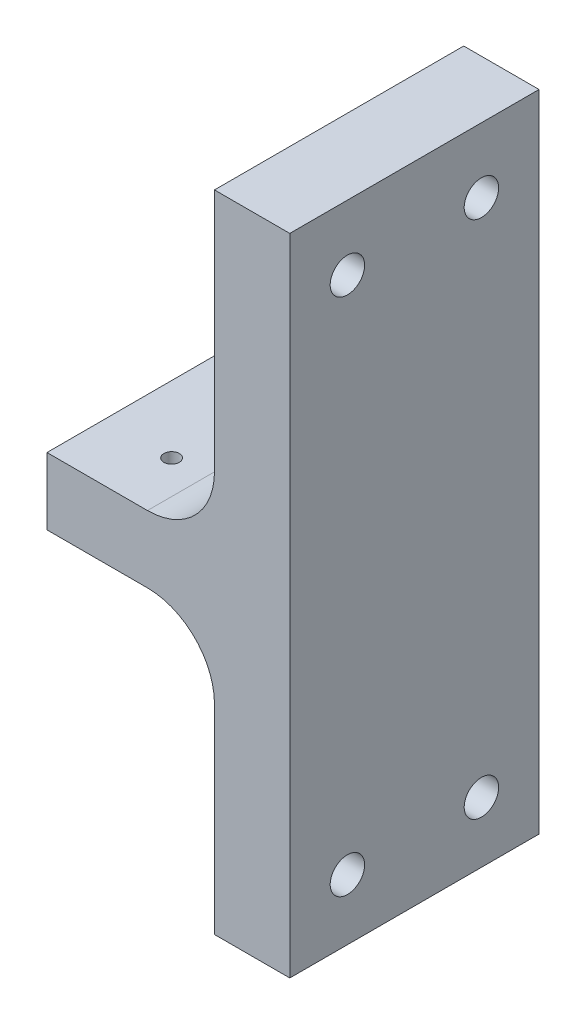
ISO-10303-21;
HEADER;
FILE_DESCRIPTION(('STEP AP214'),'2;1');
FILE_NAME('part.step','',(''),(''),'','','');
FILE_SCHEMA(('AUTOMOTIVE_DESIGN { 1 0 10303 214 1 1 1 1 }'));
ENDSEC;
DATA;
#1=APPLICATION_CONTEXT('core data for automotive mechanical design processes');
#2=APPLICATION_PROTOCOL_DEFINITION('international standard','automotive_design',2000,#1);
#3=PRODUCT_CONTEXT('',#1,'mechanical');
#4=PRODUCT('Part','Part','',(#3));
#5=PRODUCT_RELATED_PRODUCT_CATEGORY('part','',(#4));
#6=PRODUCT_DEFINITION_FORMATION('','',#4);
#7=PRODUCT_DEFINITION_CONTEXT('part definition',#1,'design');
#8=PRODUCT_DEFINITION('design','',#6,#7);
#9=PRODUCT_DEFINITION_SHAPE('','',#8);
#10=(LENGTH_UNIT() NAMED_UNIT(*) SI_UNIT(.MILLI.,.METRE.));
#11=(NAMED_UNIT(*) PLANE_ANGLE_UNIT() SI_UNIT($,.RADIAN.));
#12=(NAMED_UNIT(*) SI_UNIT($,.STERADIAN.) SOLID_ANGLE_UNIT());
#13=UNCERTAINTY_MEASURE_WITH_UNIT(LENGTH_MEASURE(1.E-05),#10,'distance_accuracy_value','');
#14=(GEOMETRIC_REPRESENTATION_CONTEXT(3) GLOBAL_UNCERTAINTY_ASSIGNED_CONTEXT((#13)) GLOBAL_UNIT_ASSIGNED_CONTEXT((#10,
#11,#12)) REPRESENTATION_CONTEXT('',''));
#15=CARTESIAN_POINT('',(0.,0.,0.));
#16=DIRECTION('',(0.,0.,1.));
#17=DIRECTION('',(1.,0.,0.));
#18=AXIS2_PLACEMENT_3D('',#15,#16,#17);
#19=CARTESIAN_POINT('',(0.,12.7,0.));
#20=DIRECTION('',(0.,-1.,0.));
#21=DIRECTION('',(0.,0.,-1.));
#22=AXIS2_PLACEMENT_3D('',#19,#20,#21);
#23=PLANE('',#22);
#24=DIRECTION('',(1.,0.,0.));
#25=VECTOR('',#24,1.);
#26=CARTESIAN_POINT('',(-12.7,12.7,23.622));
#27=LINE('',#26,#25);
#28=CARTESIAN_POINT('',(-12.7,12.7,23.622));
#29=VERTEX_POINT('',#28);
#30=CARTESIAN_POINT('',(6.35000000000001,12.7,23.622));
#31=VERTEX_POINT('',#30);
#32=EDGE_CURVE('E202',#29,#31,#27,.T.);
#33=ORIENTED_EDGE('',*,*,#32,.T.);
#34=DIRECTION('',(0.,0.,-1.));
#35=VECTOR('',#34,1.);
#36=CARTESIAN_POINT('',(6.35,12.7,0.));
#37=LINE('',#36,#35);
#38=CARTESIAN_POINT('',(6.35,12.7,-23.622));
#39=VERTEX_POINT('',#38);
#40=EDGE_CURVE('E222',#31,#39,#37,.T.);
#41=ORIENTED_EDGE('',*,*,#40,.T.);
#42=DIRECTION('',(-1.,0.,0.));
#43=VECTOR('',#42,1.);
#44=CARTESIAN_POINT('',(12.7,12.7,-23.622));
#45=LINE('',#44,#43);
#46=CARTESIAN_POINT('',(-12.7,12.7,-23.622));
#47=VERTEX_POINT('',#46);
#48=EDGE_CURVE('E195',#39,#47,#45,.T.);
#49=ORIENTED_EDGE('',*,*,#48,.T.);
#50=DIRECTION('',(0.,0.,1.));
#51=VECTOR('',#50,1.);
#52=CARTESIAN_POINT('',(-12.7,12.7,23.622));
#53=LINE('',#52,#51);
#54=EDGE_CURVE('E198',#47,#29,#53,.T.);
#55=ORIENTED_EDGE('',*,*,#54,.T.);
#56=EDGE_LOOP('',(#33,#41,#49,#55));
#57=FACE_BOUND('',#56,.T.);
#58=CARTESIAN_POINT('',(0.,12.7,-12.7));
#59=DIRECTION('',(0.,1.,0.));
#60=DIRECTION('',(0.,0.,1.));
#61=AXIS2_PLACEMENT_3D('',#58,#59,#60);
#62=CIRCLE('',#61,1.4605);
#63=CARTESIAN_POINT('',(0.,12.7,-11.2395));
#64=VERTEX_POINT('',#63);
#65=EDGE_CURVE('E187',#64,#64,#62,.T.);
#66=ORIENTED_EDGE('',*,*,#65,.F.);
#67=EDGE_LOOP('',(#66));
#68=FACE_BOUND('',#67,.T.);
#69=CARTESIAN_POINT('',(0.,12.7,12.7));
#70=DIRECTION('',(0.,1.,0.));
#71=DIRECTION('',(0.,0.,1.));
#72=AXIS2_PLACEMENT_3D('',#69,#70,#71);
#73=CIRCLE('',#72,1.4605);
#74=CARTESIAN_POINT('',(0.,12.7,14.1605));
#75=VERTEX_POINT('',#74);
#76=EDGE_CURVE('E179',#75,#75,#73,.T.);
#77=ORIENTED_EDGE('',*,*,#76,.F.);
#78=EDGE_LOOP('',(#77));
#79=FACE_BOUND('',#78,.T.);
#80=ADVANCED_FACE('F42',(#57,#68,#79),#23,.F.);
#81=CARTESIAN_POINT('',(0.,0.,0.));
#82=DIRECTION('',(0.,-1.,0.));
#83=DIRECTION('',(0.,0.,-1.));
#84=AXIS2_PLACEMENT_3D('',#81,#82,#83);
#85=PLANE('',#84);
#86=CARTESIAN_POINT('',(0.,0.,-12.7));
#87=DIRECTION('',(0.,1.,0.));
#88=DIRECTION('',(0.,0.,1.));
#89=AXIS2_PLACEMENT_3D('',#86,#87,#88);
#90=CIRCLE('',#89,1.4605);
#91=CARTESIAN_POINT('',(0.,0.,-11.2395));
#92=VERTEX_POINT('',#91);
#93=EDGE_CURVE('E183',#92,#92,#90,.T.);
#94=ORIENTED_EDGE('',*,*,#93,.T.);
#95=EDGE_LOOP('',(#94));
#96=FACE_BOUND('',#95,.T.);
#97=DIRECTION('',(-1.,0.,0.));
#98=VECTOR('',#97,1.);
#99=CARTESIAN_POINT('',(-12.7,0.,-23.622));
#100=LINE('',#99,#98);
#101=CARTESIAN_POINT('',(6.35,0.,-23.622));
#102=VERTEX_POINT('',#101);
#103=CARTESIAN_POINT('',(-12.7,0.,-23.622));
#104=VERTEX_POINT('',#103);
#105=EDGE_CURVE('E191',#102,#104,#100,.T.);
#106=ORIENTED_EDGE('',*,*,#105,.F.);
#107=DIRECTION('',(0.,0.,-1.));
#108=VECTOR('',#107,1.);
#109=CARTESIAN_POINT('',(6.35000000000001,0.,23.622));
#110=LINE('',#109,#108);
#111=CARTESIAN_POINT('',(6.35000000000001,0.,23.622));
#112=VERTEX_POINT('',#111);
#113=EDGE_CURVE('E60',#102,#112,#110,.F.);
#114=ORIENTED_EDGE('',*,*,#113,.T.);
#115=DIRECTION('',(1.,0.,0.));
#116=VECTOR('',#115,1.);
#117=CARTESIAN_POINT('',(12.7,0.,23.622));
#118=LINE('',#117,#116);
#119=CARTESIAN_POINT('',(-12.7,0.,23.622));
#120=VERTEX_POINT('',#119);
#121=EDGE_CURVE('E199',#120,#112,#118,.T.);
#122=ORIENTED_EDGE('',*,*,#121,.F.);
#123=DIRECTION('',(0.,0.,1.));
#124=VECTOR('',#123,1.);
#125=CARTESIAN_POINT('',(-12.7,0.,23.622));
#126=LINE('',#125,#124);
#127=EDGE_CURVE('E209',#104,#120,#126,.T.);
#128=ORIENTED_EDGE('',*,*,#127,.F.);
#129=EDGE_LOOP('',(#106,#114,#122,#128));
#130=FACE_BOUND('',#129,.T.);
#131=CARTESIAN_POINT('',(0.,0.,12.7));
#132=DIRECTION('',(0.,1.,0.));
#133=DIRECTION('',(0.,0.,1.));
#134=AXIS2_PLACEMENT_3D('',#131,#132,#133);
#135=CIRCLE('',#134,1.4605);
#136=CARTESIAN_POINT('',(0.,0.,14.1605));
#137=VERTEX_POINT('',#136);
#138=EDGE_CURVE('E141',#137,#137,#135,.T.);
#139=ORIENTED_EDGE('',*,*,#138,.T.);
#140=EDGE_LOOP('',(#139));
#141=FACE_BOUND('',#140,.T.);
#142=ADVANCED_FACE('F317',(#96,#130,#141),#85,.T.);
#143=CARTESIAN_POINT('',(-12.7,12.7,-23.622));
#144=DIRECTION('',(0.,0.,1.));
#145=DIRECTION('',(1.,0.,0.));
#146=AXIS2_PLACEMENT_3D('',#143,#144,#145);
#147=PLANE('',#146);
#148=DIRECTION('',(0.,1.,0.));
#149=VECTOR('',#148,1.);
#150=CARTESIAN_POINT('',(19.05,71.6788,-23.622));
#151=LINE('',#150,#149);
#152=CARTESIAN_POINT('',(19.05,-50.546,-23.622));
#153=VERTEX_POINT('',#152);
#154=CARTESIAN_POINT('',(19.05,-12.7,-23.622));
#155=VERTEX_POINT('',#154);
#156=EDGE_CURVE('E165',#153,#155,#151,.T.);
#157=ORIENTED_EDGE('',*,*,#156,.T.);
#158=CARTESIAN_POINT('',(6.35,-12.7,-23.622));
#159=DIRECTION('',(0.,0.,1.));
#160=DIRECTION('',(1.,0.,0.));
#161=AXIS2_PLACEMENT_3D('',#158,#159,#160);
#162=CIRCLE('',#161,12.7);
#163=EDGE_CURVE('E52',#155,#102,#162,.T.);
#164=ORIENTED_EDGE('',*,*,#163,.T.);
#165=ORIENTED_EDGE('',*,*,#105,.T.);
#166=DIRECTION('',(0.,-1.,0.));
#167=VECTOR('',#166,1.);
#168=CARTESIAN_POINT('',(-12.7,12.7,-23.622));
#169=LINE('',#168,#167);
#170=EDGE_CURVE('E218',#47,#104,#169,.T.);
#171=ORIENTED_EDGE('',*,*,#170,.F.);
#172=ORIENTED_EDGE('',*,*,#48,.F.);
#173=CARTESIAN_POINT('',(6.35,25.4,-23.622));
#174=DIRECTION('',(0.,0.,1.));
#175=DIRECTION('',(1.,0.,0.));
#176=AXIS2_PLACEMENT_3D('',#173,#174,#175);
#177=CIRCLE('',#176,12.7);
#178=CARTESIAN_POINT('',(19.05,25.4,-23.622));
#179=VERTEX_POINT('',#178);
#180=EDGE_CURVE('E235',#39,#179,#177,.T.);
#181=ORIENTED_EDGE('',*,*,#180,.T.);
#182=CARTESIAN_POINT('',(19.05,71.6788,-23.622));
#183=VERTEX_POINT('',#182);
#184=EDGE_CURVE('E164',#179,#183,#151,.T.);
#185=ORIENTED_EDGE('',*,*,#184,.T.);
#186=DIRECTION('',(-1.,0.,0.));
#187=VECTOR('',#186,1.);
#188=CARTESIAN_POINT('',(33.3248,71.6788,-23.622));
#189=LINE('',#188,#187);
#190=CARTESIAN_POINT('',(33.3248,71.6788,-23.622));
#191=VERTEX_POINT('',#190);
#192=EDGE_CURVE('E173',#191,#183,#189,.T.);
#193=ORIENTED_EDGE('',*,*,#192,.F.);
#194=DIRECTION('',(0.,1.,0.));
#195=VECTOR('',#194,1.);
#196=CARTESIAN_POINT('',(33.3248,71.6788,-23.622));
#197=LINE('',#196,#195);
#198=CARTESIAN_POINT('',(33.3248,-50.546,-23.622));
#199=VERTEX_POINT('',#198);
#200=EDGE_CURVE('E148',#199,#191,#197,.T.);
#201=ORIENTED_EDGE('',*,*,#200,.F.);
#202=DIRECTION('',(-1.,0.,0.));
#203=VECTOR('',#202,1.);
#204=CARTESIAN_POINT('',(33.3248,-50.546,-23.622));
#205=LINE('',#204,#203);
#206=EDGE_CURVE('E142',#199,#153,#205,.T.);
#207=ORIENTED_EDGE('',*,*,#206,.T.);
#208=EDGE_LOOP('',(#157,#164,#165,#171,#172,#181,#185,#193,#201,#207));
#209=FACE_BOUND('',#208,.T.);
#210=ADVANCED_FACE('F274',(#209),#147,.F.);
#211=CARTESIAN_POINT('',(-12.7,12.7,23.622));
#212=DIRECTION('',(1.,0.,0.));
#213=DIRECTION('',(0.,0.,-1.));
#214=AXIS2_PLACEMENT_3D('',#211,#212,#213);
#215=PLANE('',#214);
#216=ORIENTED_EDGE('',*,*,#127,.T.);
#217=DIRECTION('',(0.,-1.,0.));
#218=VECTOR('',#217,1.);
#219=CARTESIAN_POINT('',(-12.7,12.7,23.622));
#220=LINE('',#219,#218);
#221=EDGE_CURVE('E206',#29,#120,#220,.T.);
#222=ORIENTED_EDGE('',*,*,#221,.F.);
#223=ORIENTED_EDGE('',*,*,#54,.F.);
#224=ORIENTED_EDGE('',*,*,#170,.T.);
#225=EDGE_LOOP('',(#216,#222,#223,#224));
#226=FACE_BOUND('',#225,.T.);
#227=ADVANCED_FACE('F294',(#226),#215,.F.);
#228=CARTESIAN_POINT('',(12.7,12.7,23.622));
#229=DIRECTION('',(0.,0.,-1.));
#230=DIRECTION('',(-1.,0.,0.));
#231=AXIS2_PLACEMENT_3D('',#228,#229,#230);
#232=PLANE('',#231);
#233=ORIENTED_EDGE('',*,*,#121,.T.);
#234=CARTESIAN_POINT('',(6.35000000000001,-12.7,23.622));
#235=DIRECTION('',(0.,0.,-1.));
#236=DIRECTION('',(-1.,0.,0.));
#237=AXIS2_PLACEMENT_3D('',#234,#235,#236);
#238=CIRCLE('',#237,12.7);
#239=CARTESIAN_POINT('',(19.05,-12.7,23.622));
#240=VERTEX_POINT('',#239);
#241=EDGE_CURVE('E11',#112,#240,#238,.T.);
#242=ORIENTED_EDGE('',*,*,#241,.T.);
#243=DIRECTION('',(0.,-1.,0.));
#244=VECTOR('',#243,1.);
#245=CARTESIAN_POINT('',(19.05,0.,23.622));
#246=LINE('',#245,#244);
#247=CARTESIAN_POINT('',(19.05,-50.546,23.622));
#248=VERTEX_POINT('',#247);
#249=EDGE_CURVE('E137',#240,#248,#246,.T.);
#250=ORIENTED_EDGE('',*,*,#249,.T.);
#251=DIRECTION('',(-1.,0.,0.));
#252=VECTOR('',#251,1.);
#253=CARTESIAN_POINT('',(33.3248,-50.546,23.622));
#254=LINE('',#253,#252);
#255=CARTESIAN_POINT('',(33.3248,-50.546,23.622));
#256=VERTEX_POINT('',#255);
#257=EDGE_CURVE('E134',#256,#248,#254,.T.);
#258=ORIENTED_EDGE('',*,*,#257,.F.);
#259=DIRECTION('',(0.,-1.,0.));
#260=VECTOR('',#259,1.);
#261=CARTESIAN_POINT('',(33.3248,0.,23.622));
#262=LINE('',#261,#260);
#263=CARTESIAN_POINT('',(33.3248,71.6788,23.622));
#264=VERTEX_POINT('',#263);
#265=EDGE_CURVE('E119',#264,#256,#262,.T.);
#266=ORIENTED_EDGE('',*,*,#265,.F.);
#267=DIRECTION('',(-1.,0.,0.));
#268=VECTOR('',#267,1.);
#269=CARTESIAN_POINT('',(33.3248,71.6788,23.622));
#270=LINE('',#269,#268);
#271=CARTESIAN_POINT('',(19.05,71.6788,23.622));
#272=VERTEX_POINT('',#271);
#273=EDGE_CURVE('E156',#264,#272,#270,.T.);
#274=ORIENTED_EDGE('',*,*,#273,.T.);
#275=CARTESIAN_POINT('',(19.05,25.4,23.622));
#276=VERTEX_POINT('',#275);
#277=EDGE_CURVE('E157',#272,#276,#246,.T.);
#278=ORIENTED_EDGE('',*,*,#277,.T.);
#279=CARTESIAN_POINT('',(6.35000000000001,25.4,23.622));
#280=DIRECTION('',(0.,0.,-1.));
#281=DIRECTION('',(-1.,0.,0.));
#282=AXIS2_PLACEMENT_3D('',#279,#280,#281);
#283=CIRCLE('',#282,12.7);
#284=EDGE_CURVE('E238',#276,#31,#283,.T.);
#285=ORIENTED_EDGE('',*,*,#284,.T.);
#286=ORIENTED_EDGE('',*,*,#32,.F.);
#287=ORIENTED_EDGE('',*,*,#221,.T.);
#288=EDGE_LOOP('',(#233,#242,#250,#258,#266,#274,#278,#285,#286,#287));
#289=FACE_BOUND('',#288,.T.);
#290=ADVANCED_FACE('F135',(#289),#232,.F.);
#291=CARTESIAN_POINT('',(0.,12.7,-12.7));
#292=DIRECTION('',(0.,-1.,0.));
#293=DIRECTION('',(0.,0.,-1.));
#294=AXIS2_PLACEMENT_3D('',#291,#292,#293);
#295=CYLINDRICAL_SURFACE('',#294,1.4605);
#296=ORIENTED_EDGE('',*,*,#65,.T.);
#297=EDGE_LOOP('',(#296));
#298=FACE_BOUND('',#297,.T.);
#299=ORIENTED_EDGE('',*,*,#93,.F.);
#300=EDGE_LOOP('',(#299));
#301=FACE_BOUND('',#300,.T.);
#302=ADVANCED_FACE('F325',(#298,#301),#295,.F.);
#303=CARTESIAN_POINT('',(0.,12.7,12.7));
#304=DIRECTION('',(0.,-1.,0.));
#305=DIRECTION('',(0.,0.,-1.));
#306=AXIS2_PLACEMENT_3D('',#303,#304,#305);
#307=CYLINDRICAL_SURFACE('',#306,1.4605);
#308=ORIENTED_EDGE('',*,*,#76,.T.);
#309=EDGE_LOOP('',(#308));
#310=FACE_BOUND('',#309,.T.);
#311=ORIENTED_EDGE('',*,*,#138,.F.);
#312=EDGE_LOOP('',(#311));
#313=FACE_BOUND('',#312,.T.);
#314=ADVANCED_FACE('F314',(#310,#313),#307,.F.);
#315=CARTESIAN_POINT('',(19.05,0.,0.));
#316=DIRECTION('',(-1.,0.,0.));
#317=DIRECTION('',(0.,0.,1.));
#318=AXIS2_PLACEMENT_3D('',#315,#316,#317);
#319=PLANE('',#318);
#320=CARTESIAN_POINT('',(19.05,59.3852,12.7));
#321=DIRECTION('',(-1.,0.,0.));
#322=DIRECTION('',(0.,0.,1.));
#323=AXIS2_PLACEMENT_3D('',#320,#321,#322);
#324=CIRCLE('',#323,3.26390000000001);
#325=CARTESIAN_POINT('',(19.05,59.3852,15.9639));
#326=VERTEX_POINT('',#325);
#327=EDGE_CURVE('E265',#326,#326,#324,.T.);
#328=ORIENTED_EDGE('',*,*,#327,.F.);
#329=EDGE_LOOP('',(#328));
#330=FACE_BOUND('',#329,.T.);
#331=CARTESIAN_POINT('',(19.05,59.3852,-12.7));
#332=DIRECTION('',(-1.,0.,0.));
#333=DIRECTION('',(0.,0.,1.));
#334=AXIS2_PLACEMENT_3D('',#331,#332,#333);
#335=CIRCLE('',#334,3.26390000000001);
#336=CARTESIAN_POINT('',(19.05,59.3852,-9.43609999999999));
#337=VERTEX_POINT('',#336);
#338=EDGE_CURVE('E251',#337,#337,#335,.T.);
#339=ORIENTED_EDGE('',*,*,#338,.F.);
#340=EDGE_LOOP('',(#339));
#341=FACE_BOUND('',#340,.T.);
#342=ORIENTED_EDGE('',*,*,#184,.F.);
#343=DIRECTION('',(0.,0.,-1.));
#344=VECTOR('',#343,1.);
#345=CARTESIAN_POINT('',(19.05,25.4,0.));
#346=LINE('',#345,#344);
#347=EDGE_CURVE('E226',#179,#276,#346,.F.);
#348=ORIENTED_EDGE('',*,*,#347,.T.);
#349=ORIENTED_EDGE('',*,*,#277,.F.);
#350=DIRECTION('',(0.,0.,1.));
#351=VECTOR('',#350,1.);
#352=CARTESIAN_POINT('',(19.05,71.6788,23.622));
#353=LINE('',#352,#351);
#354=EDGE_CURVE('E131',#183,#272,#353,.T.);
#355=ORIENTED_EDGE('',*,*,#354,.F.);
#356=EDGE_LOOP('',(#342,#348,#349,#355));
#357=FACE_BOUND('',#356,.T.);
#358=ADVANCED_FACE('F281',(#330,#341,#357),#319,.T.);
#359=CARTESIAN_POINT('',(33.3248,-50.546,23.622));
#360=DIRECTION('',(0.,1.,0.));
#361=DIRECTION('',(0.,0.,1.));
#362=AXIS2_PLACEMENT_3D('',#359,#360,#361);
#363=PLANE('',#362);
#364=DIRECTION('',(0.,0.,-1.));
#365=VECTOR('',#364,1.);
#366=CARTESIAN_POINT('',(19.05,-50.546,23.622));
#367=LINE('',#366,#365);
#368=EDGE_CURVE('E161',#248,#153,#367,.T.);
#369=ORIENTED_EDGE('',*,*,#368,.T.);
#370=ORIENTED_EDGE('',*,*,#206,.F.);
#371=DIRECTION('',(0.,0.,-1.));
#372=VECTOR('',#371,1.);
#373=CARTESIAN_POINT('',(33.3248,-50.546,23.622));
#374=LINE('',#373,#372);
#375=EDGE_CURVE('E123',#256,#199,#374,.T.);
#376=ORIENTED_EDGE('',*,*,#375,.F.);
#377=ORIENTED_EDGE('',*,*,#257,.T.);
#378=EDGE_LOOP('',(#369,#370,#376,#377));
#379=FACE_BOUND('',#378,.T.);
#380=ADVANCED_FACE('F144',(#379),#363,.F.);
#381=CARTESIAN_POINT('',(33.3248,71.6788,23.622));
#382=DIRECTION('',(0.,-1.,0.));
#383=DIRECTION('',(0.,0.,-1.));
#384=AXIS2_PLACEMENT_3D('',#381,#382,#383);
#385=PLANE('',#384);
#386=ORIENTED_EDGE('',*,*,#354,.T.);
#387=ORIENTED_EDGE('',*,*,#273,.F.);
#388=DIRECTION('',(0.,0.,1.));
#389=VECTOR('',#388,1.);
#390=CARTESIAN_POINT('',(33.3248,71.6788,23.622));
#391=LINE('',#390,#389);
#392=EDGE_CURVE('E126',#191,#264,#391,.T.);
#393=ORIENTED_EDGE('',*,*,#392,.F.);
#394=ORIENTED_EDGE('',*,*,#192,.T.);
#395=EDGE_LOOP('',(#386,#387,#393,#394));
#396=FACE_BOUND('',#395,.T.);
#397=ADVANCED_FACE('F280',(#396),#385,.F.);
#398=CARTESIAN_POINT('',(33.3248,0.,0.));
#399=DIRECTION('',(-1.,0.,0.));
#400=DIRECTION('',(0.,0.,1.));
#401=AXIS2_PLACEMENT_3D('',#398,#399,#400);
#402=PLANE('',#401);
#403=CARTESIAN_POINT('',(33.3248,-39.0398,-12.7));
#404=DIRECTION('',(1.,0.,0.));
#405=DIRECTION('',(0.,0.,-1.));
#406=AXIS2_PLACEMENT_3D('',#403,#404,#405);
#407=CIRCLE('',#406,3.26390000000001);
#408=CARTESIAN_POINT('',(33.3248,-39.0398,-15.9639));
#409=VERTEX_POINT('',#408);
#410=EDGE_CURVE('E253',#409,#409,#407,.T.);
#411=ORIENTED_EDGE('',*,*,#410,.F.);
#412=EDGE_LOOP('',(#411));
#413=FACE_BOUND('',#412,.T.);
#414=CARTESIAN_POINT('',(33.3248,59.3852,12.7));
#415=DIRECTION('',(1.,0.,0.));
#416=DIRECTION('',(0.,0.,-1.));
#417=AXIS2_PLACEMENT_3D('',#414,#415,#416);
#418=CIRCLE('',#417,3.26390000000001);
#419=CARTESIAN_POINT('',(33.3248,59.3852,9.43609999999998));
#420=VERTEX_POINT('',#419);
#421=EDGE_CURVE('E259',#420,#420,#418,.T.);
#422=ORIENTED_EDGE('',*,*,#421,.F.);
#423=EDGE_LOOP('',(#422));
#424=FACE_BOUND('',#423,.T.);
#425=CARTESIAN_POINT('',(33.3248,59.3852,-12.7));
#426=DIRECTION('',(1.,0.,0.));
#427=DIRECTION('',(0.,0.,-1.));
#428=AXIS2_PLACEMENT_3D('',#425,#426,#427);
#429=CIRCLE('',#428,3.26390000000001);
#430=CARTESIAN_POINT('',(33.3248,59.3852,-15.9639));
#431=VERTEX_POINT('',#430);
#432=EDGE_CURVE('E515',#431,#431,#429,.T.);
#433=ORIENTED_EDGE('',*,*,#432,.F.);
#434=EDGE_LOOP('',(#433));
#435=FACE_BOUND('',#434,.T.);
#436=CARTESIAN_POINT('',(33.3248,-39.0398,12.7));
#437=DIRECTION('',(1.,0.,0.));
#438=DIRECTION('',(0.,0.,-1.));
#439=AXIS2_PLACEMENT_3D('',#436,#437,#438);
#440=CIRCLE('',#439,3.26390000000001);
#441=CARTESIAN_POINT('',(33.3248,-39.0398,9.43609999999998));
#442=VERTEX_POINT('',#441);
#443=EDGE_CURVE('E245',#442,#442,#440,.T.);
#444=ORIENTED_EDGE('',*,*,#443,.F.);
#445=EDGE_LOOP('',(#444));
#446=FACE_BOUND('',#445,.T.);
#447=ORIENTED_EDGE('',*,*,#265,.T.);
#448=ORIENTED_EDGE('',*,*,#375,.T.);
#449=ORIENTED_EDGE('',*,*,#200,.T.);
#450=ORIENTED_EDGE('',*,*,#392,.T.);
#451=EDGE_LOOP('',(#447,#448,#449,#450));
#452=FACE_BOUND('',#451,.T.);
#453=ADVANCED_FACE('F121',(#413,#424,#435,#446,#452),#402,.F.);
#454=CARTESIAN_POINT('',(19.05,-39.0398,-12.7));
#455=DIRECTION('',(-1.,0.,0.));
#456=DIRECTION('',(0.,0.,1.));
#457=AXIS2_PLACEMENT_3D('',#454,#455,#456);
#458=CIRCLE('',#457,3.26390000000001);
#459=CARTESIAN_POINT('',(19.05,-39.0398,-9.4361));
#460=VERTEX_POINT('',#459);
#461=EDGE_CURVE('E46',#460,#460,#458,.T.);
#462=ORIENTED_EDGE('',*,*,#461,.F.);
#463=EDGE_LOOP('',(#462));
#464=FACE_BOUND('',#463,.T.);
#465=CARTESIAN_POINT('',(19.05,-39.0398,12.7));
#466=DIRECTION('',(-1.,0.,0.));
#467=DIRECTION('',(0.,0.,1.));
#468=AXIS2_PLACEMENT_3D('',#465,#466,#467);
#469=CIRCLE('',#468,3.26390000000001);
#470=CARTESIAN_POINT('',(19.05,-39.0398,15.9639));
#471=VERTEX_POINT('',#470);
#472=EDGE_CURVE('E242',#471,#471,#469,.T.);
#473=ORIENTED_EDGE('',*,*,#472,.F.);
#474=EDGE_LOOP('',(#473));
#475=FACE_BOUND('',#474,.T.);
#476=ORIENTED_EDGE('',*,*,#249,.F.);
#477=DIRECTION('',(0.,0.,-1.));
#478=VECTOR('',#477,1.);
#479=CARTESIAN_POINT('',(19.05,-12.7,-23.622));
#480=LINE('',#479,#478);
#481=EDGE_CURVE('E229',#240,#155,#480,.T.);
#482=ORIENTED_EDGE('',*,*,#481,.T.);
#483=ORIENTED_EDGE('',*,*,#156,.F.);
#484=ORIENTED_EDGE('',*,*,#368,.F.);
#485=EDGE_LOOP('',(#476,#482,#483,#484));
#486=FACE_BOUND('',#485,.T.);
#487=ADVANCED_FACE('F300',(#464,#475,#486),#319,.T.);
#488=CARTESIAN_POINT('',(6.35,25.4,0.));
#489=DIRECTION('',(0.,0.,-1.));
#490=DIRECTION('',(-1.,0.,0.));
#491=AXIS2_PLACEMENT_3D('',#488,#489,#490);
#492=CYLINDRICAL_SURFACE('',#491,12.7);
#493=ORIENTED_EDGE('',*,*,#284,.F.);
#494=ORIENTED_EDGE('',*,*,#347,.F.);
#495=ORIENTED_EDGE('',*,*,#180,.F.);
#496=ORIENTED_EDGE('',*,*,#40,.F.);
#497=EDGE_LOOP('',(#493,#494,#495,#496));
#498=FACE_BOUND('',#497,.T.);
#499=ADVANCED_FACE('F286',(#498),#492,.F.);
#500=CARTESIAN_POINT('',(6.35,-12.7,0.));
#501=DIRECTION('',(0.,0.,1.));
#502=DIRECTION('',(1.,0.,0.));
#503=AXIS2_PLACEMENT_3D('',#500,#501,#502);
#504=CYLINDRICAL_SURFACE('',#503,12.7);
#505=ORIENTED_EDGE('',*,*,#241,.F.);
#506=ORIENTED_EDGE('',*,*,#113,.F.);
#507=ORIENTED_EDGE('',*,*,#163,.F.);
#508=ORIENTED_EDGE('',*,*,#481,.F.);
#509=EDGE_LOOP('',(#505,#506,#507,#508));
#510=FACE_BOUND('',#509,.T.);
#511=ADVANCED_FACE('F44',(#510),#504,.F.);
#512=CARTESIAN_POINT('',(-12.7,-39.0398,12.7));
#513=DIRECTION('',(1.,0.,0.));
#514=DIRECTION('',(0.,0.,-1.));
#515=AXIS2_PLACEMENT_3D('',#512,#513,#514);
#516=CYLINDRICAL_SURFACE('',#515,3.26390000000001);
#517=ORIENTED_EDGE('',*,*,#472,.T.);
#518=EDGE_LOOP('',(#517));
#519=FACE_BOUND('',#518,.T.);
#520=ORIENTED_EDGE('',*,*,#443,.T.);
#521=EDGE_LOOP('',(#520));
#522=FACE_BOUND('',#521,.T.);
#523=ADVANCED_FACE('F390',(#519,#522),#516,.F.);
#524=CARTESIAN_POINT('',(-12.7,-39.0398,-12.7));
#525=DIRECTION('',(1.,0.,0.));
#526=DIRECTION('',(0.,0.,-1.));
#527=AXIS2_PLACEMENT_3D('',#524,#525,#526);
#528=CYLINDRICAL_SURFACE('',#527,3.26390000000001);
#529=ORIENTED_EDGE('',*,*,#461,.T.);
#530=EDGE_LOOP('',(#529));
#531=FACE_BOUND('',#530,.T.);
#532=ORIENTED_EDGE('',*,*,#410,.T.);
#533=EDGE_LOOP('',(#532));
#534=FACE_BOUND('',#533,.T.);
#535=ADVANCED_FACE('F395',(#531,#534),#528,.F.);
#536=CARTESIAN_POINT('',(-12.7,59.3852,-12.7));
#537=DIRECTION('',(1.,0.,0.));
#538=DIRECTION('',(0.,0.,-1.));
#539=AXIS2_PLACEMENT_3D('',#536,#537,#538);
#540=CYLINDRICAL_SURFACE('',#539,3.26390000000001);
#541=ORIENTED_EDGE('',*,*,#338,.T.);
#542=EDGE_LOOP('',(#541));
#543=FACE_BOUND('',#542,.T.);
#544=ORIENTED_EDGE('',*,*,#432,.T.);
#545=EDGE_LOOP('',(#544));
#546=FACE_BOUND('',#545,.T.);
#547=ADVANCED_FACE('F407',(#543,#546),#540,.F.);
#548=CARTESIAN_POINT('',(-12.7,59.3852,12.7));
#549=DIRECTION('',(1.,0.,0.));
#550=DIRECTION('',(0.,0.,-1.));
#551=AXIS2_PLACEMENT_3D('',#548,#549,#550);
#552=CYLINDRICAL_SURFACE('',#551,3.26390000000001);
#553=ORIENTED_EDGE('',*,*,#327,.T.);
#554=EDGE_LOOP('',(#553));
#555=FACE_BOUND('',#554,.T.);
#556=ORIENTED_EDGE('',*,*,#421,.T.);
#557=EDGE_LOOP('',(#556));
#558=FACE_BOUND('',#557,.T.);
#559=ADVANCED_FACE('F418',(#555,#558),#552,.F.);
#560=CLOSED_SHELL('',(#80,#142,#210,#227,#290,#302,#314,#358,#380,#397,#453,#487,#499,#511,#523,
#535,#547,#559));
#561=MANIFOLD_SOLID_BREP('B2',#560);
#562=ADVANCED_BREP_SHAPE_REPRESENTATION('',(#18,#561),#14);
#563=SHAPE_DEFINITION_REPRESENTATION(#9,#562);
ENDSEC;
END-ISO-10303-21;
